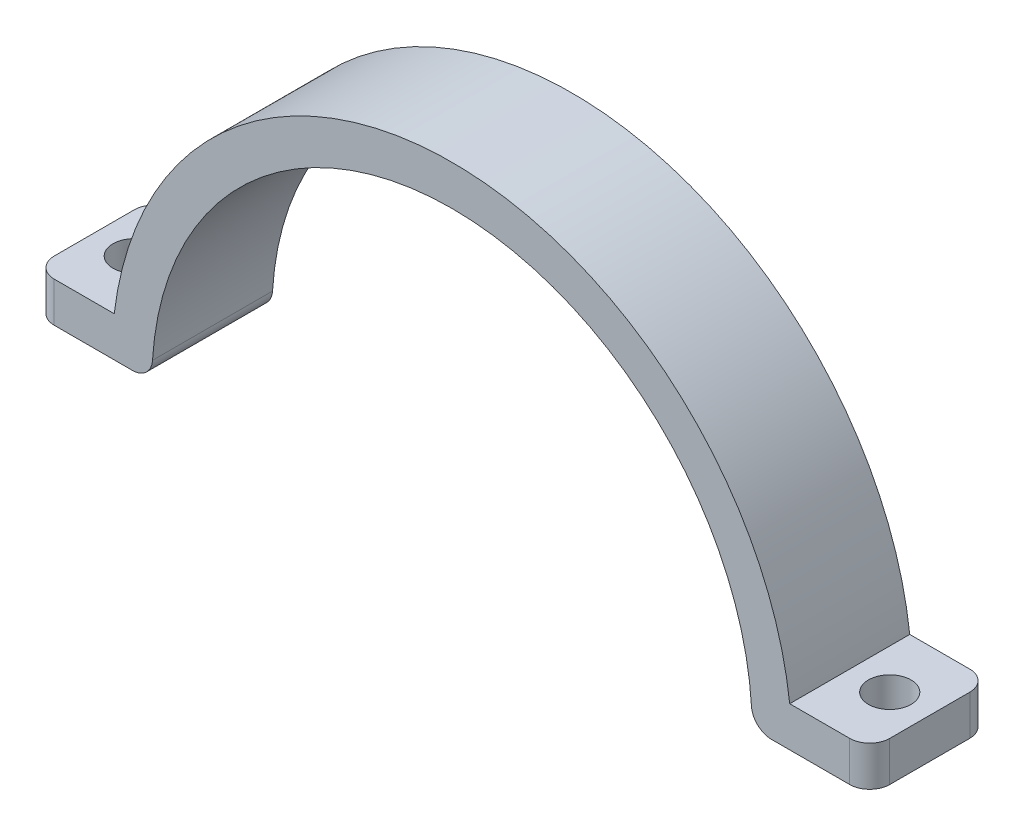
ISO-10303-21;
HEADER;
FILE_DESCRIPTION(('STEP AP214'),'2;1');
FILE_NAME('part.step','',(''),(''),'','','');
FILE_SCHEMA(('AUTOMOTIVE_DESIGN { 1 0 10303 214 1 1 1 1 }'));
ENDSEC;
DATA;
#1=APPLICATION_CONTEXT('core data for automotive mechanical design processes');
#2=APPLICATION_PROTOCOL_DEFINITION('international standard','automotive_design',2000,#1);
#3=PRODUCT_CONTEXT('',#1,'mechanical');
#4=PRODUCT('Part','Part','',(#3));
#5=PRODUCT_RELATED_PRODUCT_CATEGORY('part','',(#4));
#6=PRODUCT_DEFINITION_FORMATION('','',#4);
#7=PRODUCT_DEFINITION_CONTEXT('part definition',#1,'design');
#8=PRODUCT_DEFINITION('design','',#6,#7);
#9=PRODUCT_DEFINITION_SHAPE('','',#8);
#10=(LENGTH_UNIT() NAMED_UNIT(*) SI_UNIT(.MILLI.,.METRE.));
#11=(NAMED_UNIT(*) PLANE_ANGLE_UNIT() SI_UNIT($,.RADIAN.));
#12=(NAMED_UNIT(*) SI_UNIT($,.STERADIAN.) SOLID_ANGLE_UNIT());
#13=UNCERTAINTY_MEASURE_WITH_UNIT(LENGTH_MEASURE(1.E-05),#10,'distance_accuracy_value','');
#14=(GEOMETRIC_REPRESENTATION_CONTEXT(3) GLOBAL_UNCERTAINTY_ASSIGNED_CONTEXT((#13)) GLOBAL_UNIT_ASSIGNED_CONTEXT((#10,
#11,#12)) REPRESENTATION_CONTEXT('',''));
#15=CARTESIAN_POINT('',(0.,0.,0.));
#16=DIRECTION('',(0.,0.,1.));
#17=DIRECTION('',(1.,0.,0.));
#18=AXIS2_PLACEMENT_3D('',#15,#16,#17);
#19=CARTESIAN_POINT('',(0.,0.,9.525));
#20=DIRECTION('',(0.,0.,-1.));
#21=DIRECTION('',(-1.,0.,0.));
#22=AXIS2_PLACEMENT_3D('',#19,#20,#21);
#23=CYLINDRICAL_SURFACE('',#22,47.625);
#24=CARTESIAN_POINT('',(0.,0.,-9.525));
#25=DIRECTION('',(0.,0.,-1.));
#26=DIRECTION('',(1.,0.,0.));
#27=AXIS2_PLACEMENT_3D('',#24,#25,#26);
#28=CIRCLE('',#27,47.625);
#29=CARTESIAN_POINT('',(-47.5318914065451,2.9765625,-9.525));
#30=VERTEX_POINT('',#29);
#31=CARTESIAN_POINT('',(47.5318914065451,2.9765625,-9.525));
#32=VERTEX_POINT('',#31);
#33=EDGE_CURVE('E171',#30,#32,#28,.T.);
#34=ORIENTED_EDGE('',*,*,#33,.T.);
#35=DIRECTION('',(0.,0.,-1.));
#36=VECTOR('',#35,1.);
#37=CARTESIAN_POINT('',(47.5318914065451,2.9765625,9.525));
#38=LINE('',#37,#36);
#39=CARTESIAN_POINT('',(47.5318914065451,2.9765625,9.525));
#40=VERTEX_POINT('',#39);
#41=EDGE_CURVE('E214',#32,#40,#38,.F.);
#42=ORIENTED_EDGE('',*,*,#41,.T.);
#43=CARTESIAN_POINT('',(0.,0.,9.525));
#44=DIRECTION('',(0.,0.,-1.));
#45=DIRECTION('',(1.,0.,0.));
#46=AXIS2_PLACEMENT_3D('',#43,#44,#45);
#47=CIRCLE('',#46,47.625);
#48=CARTESIAN_POINT('',(-47.5318914065451,2.9765625,9.525));
#49=VERTEX_POINT('',#48);
#50=EDGE_CURVE('E186',#49,#40,#47,.T.);
#51=ORIENTED_EDGE('',*,*,#50,.F.);
#52=DIRECTION('',(0.,0.,-1.));
#53=VECTOR('',#52,1.);
#54=CARTESIAN_POINT('',(-47.5318914065451,2.9765625,9.525));
#55=LINE('',#54,#53);
#56=EDGE_CURVE('E211',#49,#30,#55,.T.);
#57=ORIENTED_EDGE('',*,*,#56,.T.);
#58=EDGE_LOOP('',(#34,#42,#51,#57));
#59=FACE_BOUND('',#58,.T.);
#60=ADVANCED_FACE('F33',(#59),#23,.F.);
#61=CARTESIAN_POINT('',(47.625,0.,9.525));
#62=DIRECTION('',(0.,1.,0.));
#63=DIRECTION('',(0.,0.,1.));
#64=AXIS2_PLACEMENT_3D('',#61,#62,#63);
#65=PLANE('',#64);
#66=CARTESIAN_POINT('',(59.9501690762259,0.,0.));
#67=DIRECTION('',(0.,1.,0.));
#68=DIRECTION('',(0.,0.,1.));
#69=AXIS2_PLACEMENT_3D('',#66,#67,#68);
#70=CIRCLE('',#69,3.3782);
#71=CARTESIAN_POINT('',(59.9501690762259,0.,3.3782));
#72=VERTEX_POINT('',#71);
#73=EDGE_CURVE('E175',#72,#72,#70,.F.);
#74=ORIENTED_EDGE('',*,*,#73,.F.);
#75=EDGE_LOOP('',(#74));
#76=FACE_BOUND('',#75,.T.);
#77=DIRECTION('',(1.,0.,0.));
#78=VECTOR('',#77,1.);
#79=CARTESIAN_POINT('',(47.625,0.,9.525));
#80=LINE('',#79,#78);
#81=CARTESIAN_POINT('',(50.7006841669814,0.,9.525));
#82=VERTEX_POINT('',#81);
#83=CARTESIAN_POINT('',(63.1251690762259,0.,9.525));
#84=VERTEX_POINT('',#83);
#85=EDGE_CURVE('E146',#82,#84,#80,.T.);
#86=ORIENTED_EDGE('',*,*,#85,.F.);
#87=DIRECTION('',(0.,0.,-1.));
#88=VECTOR('',#87,1.);
#89=CARTESIAN_POINT('',(50.7006841669814,0.,9.525));
#90=LINE('',#89,#88);
#91=CARTESIAN_POINT('',(50.7006841669814,0.,-9.525));
#92=VERTEX_POINT('',#91);
#93=EDGE_CURVE('E200',#82,#92,#90,.T.);
#94=ORIENTED_EDGE('',*,*,#93,.T.);
#95=DIRECTION('',(1.,0.,0.));
#96=VECTOR('',#95,1.);
#97=CARTESIAN_POINT('',(47.625,0.,-9.525));
#98=LINE('',#97,#96);
#99=CARTESIAN_POINT('',(63.1251690762259,0.,-9.525));
#100=VERTEX_POINT('',#99);
#101=EDGE_CURVE('E174',#92,#100,#98,.T.);
#102=ORIENTED_EDGE('',*,*,#101,.T.);
#103=CARTESIAN_POINT('',(63.1251690762259,0.,-6.35));
#104=DIRECTION('',(0.,1.,0.));
#105=DIRECTION('',(0.,0.,1.));
#106=AXIS2_PLACEMENT_3D('',#103,#104,#105);
#107=CIRCLE('',#106,3.175);
#108=CARTESIAN_POINT('',(66.3001690762259,0.,-6.34999999999999));
#109=VERTEX_POINT('',#108);
#110=EDGE_CURVE('E198',#100,#109,#107,.F.);
#111=ORIENTED_EDGE('',*,*,#110,.T.);
#112=DIRECTION('',(0.,0.,-1.));
#113=VECTOR('',#112,1.);
#114=CARTESIAN_POINT('',(66.3001690762259,0.,9.525));
#115=LINE('',#114,#113);
#116=CARTESIAN_POINT('',(66.3001690762259,0.,6.35));
#117=VERTEX_POINT('',#116);
#118=EDGE_CURVE('E193',#117,#109,#115,.T.);
#119=ORIENTED_EDGE('',*,*,#118,.F.);
#120=CARTESIAN_POINT('',(63.1251690762259,0.,6.35));
#121=DIRECTION('',(0.,1.,0.));
#122=DIRECTION('',(0.,0.,1.));
#123=AXIS2_PLACEMENT_3D('',#120,#121,#122);
#124=CIRCLE('',#123,3.175);
#125=EDGE_CURVE('E196',#117,#84,#124,.F.);
#126=ORIENTED_EDGE('',*,*,#125,.T.);
#127=EDGE_LOOP('',(#86,#94,#102,#111,#119,#126));
#128=FACE_BOUND('',#127,.T.);
#129=ADVANCED_FACE('F295',(#76,#128),#65,.F.);
#130=CARTESIAN_POINT('',(66.3001690762259,0.,9.525));
#131=DIRECTION('',(-1.,0.,0.));
#132=DIRECTION('',(0.,0.,1.));
#133=AXIS2_PLACEMENT_3D('',#130,#131,#132);
#134=PLANE('',#133);
#135=ORIENTED_EDGE('',*,*,#118,.T.);
#136=DIRECTION('',(0.,1.,0.));
#137=VECTOR('',#136,1.);
#138=CARTESIAN_POINT('',(66.3001690762259,0.,-6.35));
#139=LINE('',#138,#137);
#140=CARTESIAN_POINT('',(66.3001690762259,6.35,-6.34999999999999));
#141=VERTEX_POINT('',#140);
#142=EDGE_CURVE('E232',#109,#141,#139,.T.);
#143=ORIENTED_EDGE('',*,*,#142,.T.);
#144=DIRECTION('',(0.,0.,-1.));
#145=VECTOR('',#144,1.);
#146=CARTESIAN_POINT('',(66.3001690762259,6.35,9.525));
#147=LINE('',#146,#145);
#148=CARTESIAN_POINT('',(66.3001690762259,6.35,6.35));
#149=VERTEX_POINT('',#148);
#150=EDGE_CURVE('E156',#149,#141,#147,.T.);
#151=ORIENTED_EDGE('',*,*,#150,.F.);
#152=DIRECTION('',(0.,1.,0.));
#153=VECTOR('',#152,1.);
#154=CARTESIAN_POINT('',(66.3001690762259,0.,6.35));
#155=LINE('',#154,#153);
#156=EDGE_CURVE('E230',#149,#117,#155,.F.);
#157=ORIENTED_EDGE('',*,*,#156,.T.);
#158=EDGE_LOOP('',(#135,#143,#151,#157));
#159=FACE_BOUND('',#158,.T.);
#160=ADVANCED_FACE('F288',(#159),#134,.F.);
#161=CARTESIAN_POINT('',(66.3001690762259,6.35,9.525));
#162=DIRECTION('',(0.,-1.,0.));
#163=DIRECTION('',(1.,0.,0.));
#164=AXIS2_PLACEMENT_3D('',#161,#162,#163);
#165=PLANE('',#164);
#166=CARTESIAN_POINT('',(59.9501690762259,6.35,0.));
#167=DIRECTION('',(0.,1.,0.));
#168=DIRECTION('',(-1.,0.,0.));
#169=AXIS2_PLACEMENT_3D('',#166,#167,#168);
#170=CIRCLE('',#169,3.3782);
#171=CARTESIAN_POINT('',(56.5719690762259,6.35,0.));
#172=VERTEX_POINT('',#171);
#173=EDGE_CURVE('E275',#172,#172,#170,.T.);
#174=ORIENTED_EDGE('',*,*,#173,.F.);
#175=EDGE_LOOP('',(#174));
#176=FACE_BOUND('',#175,.T.);
#177=ORIENTED_EDGE('',*,*,#150,.T.);
#178=CARTESIAN_POINT('',(63.1251690762259,6.35,-6.35));
#179=DIRECTION('',(0.,-1.,0.));
#180=DIRECTION('',(1.,0.,0.));
#181=AXIS2_PLACEMENT_3D('',#178,#179,#180);
#182=CIRCLE('',#181,3.175);
#183=CARTESIAN_POINT('',(63.1251690762259,6.35,-9.525));
#184=VERTEX_POINT('',#183);
#185=EDGE_CURVE('E237',#141,#184,#182,.F.);
#186=ORIENTED_EDGE('',*,*,#185,.T.);
#187=DIRECTION('',(-1.,0.,0.));
#188=VECTOR('',#187,1.);
#189=CARTESIAN_POINT('',(66.3001690762259,6.35,-9.525));
#190=LINE('',#189,#188);
#191=CARTESIAN_POINT('',(53.6001690762259,6.35,-9.525));
#192=VERTEX_POINT('',#191);
#193=EDGE_CURVE('E153',#184,#192,#190,.T.);
#194=ORIENTED_EDGE('',*,*,#193,.T.);
#195=DIRECTION('',(0.,0.,-1.));
#196=VECTOR('',#195,1.);
#197=CARTESIAN_POINT('',(53.6001690762259,6.35,9.525));
#198=LINE('',#197,#196);
#199=CARTESIAN_POINT('',(53.6001690762259,6.35,9.525));
#200=VERTEX_POINT('',#199);
#201=EDGE_CURVE('E149',#200,#192,#198,.T.);
#202=ORIENTED_EDGE('',*,*,#201,.F.);
#203=DIRECTION('',(-1.,0.,0.));
#204=VECTOR('',#203,1.);
#205=CARTESIAN_POINT('',(66.3001690762259,6.35,9.525));
#206=LINE('',#205,#204);
#207=CARTESIAN_POINT('',(63.1251690762259,6.35,9.525));
#208=VERTEX_POINT('',#207);
#209=EDGE_CURVE('E134',#208,#200,#206,.T.);
#210=ORIENTED_EDGE('',*,*,#209,.F.);
#211=CARTESIAN_POINT('',(63.1251690762259,6.35,6.35));
#212=DIRECTION('',(0.,-1.,0.));
#213=DIRECTION('',(1.,0.,0.));
#214=AXIS2_PLACEMENT_3D('',#211,#212,#213);
#215=CIRCLE('',#214,3.175);
#216=EDGE_CURVE('E235',#208,#149,#215,.F.);
#217=ORIENTED_EDGE('',*,*,#216,.T.);
#218=EDGE_LOOP('',(#177,#186,#194,#202,#210,#217));
#219=FACE_BOUND('',#218,.T.);
#220=ADVANCED_FACE('F151',(#176,#219),#165,.F.);
#221=CARTESIAN_POINT('',(0.,0.,9.525));
#222=DIRECTION('',(0.,0.,-1.));
#223=DIRECTION('',(-1.,0.,0.));
#224=AXIS2_PLACEMENT_3D('',#221,#222,#223);
#225=CYLINDRICAL_SURFACE('',#224,53.975);
#226=CARTESIAN_POINT('',(0.,0.,-9.525));
#227=DIRECTION('',(0.,0.,1.));
#228=DIRECTION('',(1.,0.,0.));
#229=AXIS2_PLACEMENT_3D('',#226,#227,#228);
#230=CIRCLE('',#229,53.975);
#231=CARTESIAN_POINT('',(-53.6001690762259,6.35,-9.525));
#232=VERTEX_POINT('',#231);
#233=EDGE_CURVE('E179',#192,#232,#230,.T.);
#234=ORIENTED_EDGE('',*,*,#233,.T.);
#235=DIRECTION('',(0.,0.,-1.));
#236=VECTOR('',#235,1.);
#237=CARTESIAN_POINT('',(-53.6001690762259,6.35,9.525));
#238=LINE('',#237,#236);
#239=CARTESIAN_POINT('',(-53.6001690762259,6.35,9.525));
#240=VERTEX_POINT('',#239);
#241=EDGE_CURVE('E157',#240,#232,#238,.T.);
#242=ORIENTED_EDGE('',*,*,#241,.F.);
#243=CARTESIAN_POINT('',(0.,0.,9.525));
#244=DIRECTION('',(0.,0.,1.));
#245=DIRECTION('',(1.,0.,0.));
#246=AXIS2_PLACEMENT_3D('',#243,#244,#245);
#247=CIRCLE('',#246,53.975);
#248=EDGE_CURVE('E140',#200,#240,#247,.T.);
#249=ORIENTED_EDGE('',*,*,#248,.F.);
#250=ORIENTED_EDGE('',*,*,#201,.T.);
#251=EDGE_LOOP('',(#234,#242,#249,#250));
#252=FACE_BOUND('',#251,.T.);
#253=ADVANCED_FACE('F159',(#252),#225,.T.);
#254=CARTESIAN_POINT('',(-66.3001690762259,6.35,9.525));
#255=DIRECTION('',(0.,-1.,0.));
#256=DIRECTION('',(1.,0.,0.));
#257=AXIS2_PLACEMENT_3D('',#254,#255,#256);
#258=PLANE('',#257);
#259=CARTESIAN_POINT('',(-59.9501690762259,6.34999999999998,0.));
#260=DIRECTION('',(0.,1.,0.));
#261=DIRECTION('',(1.,0.,0.));
#262=AXIS2_PLACEMENT_3D('',#259,#260,#261);
#263=CIRCLE('',#262,3.3782);
#264=CARTESIAN_POINT('',(-56.5719690762259,6.34999999999998,0.));
#265=VERTEX_POINT('',#264);
#266=EDGE_CURVE('E276',#265,#265,#263,.T.);
#267=ORIENTED_EDGE('',*,*,#266,.F.);
#268=EDGE_LOOP('',(#267));
#269=FACE_BOUND('',#268,.T.);
#270=DIRECTION('',(-1.,0.,0.));
#271=VECTOR('',#270,1.);
#272=CARTESIAN_POINT('',(-66.3001690762259,6.35,-9.525));
#273=LINE('',#272,#271);
#274=CARTESIAN_POINT('',(-63.1251690762259,6.35,-9.525));
#275=VERTEX_POINT('',#274);
#276=EDGE_CURVE('E181',#232,#275,#273,.T.);
#277=ORIENTED_EDGE('',*,*,#276,.T.);
#278=CARTESIAN_POINT('',(-63.1251690762259,6.35,-6.35));
#279=DIRECTION('',(0.,-1.,0.));
#280=DIRECTION('',(1.,0.,0.));
#281=AXIS2_PLACEMENT_3D('',#278,#279,#280);
#282=CIRCLE('',#281,3.175);
#283=CARTESIAN_POINT('',(-66.3001690762259,6.35,-6.34999999999999));
#284=VERTEX_POINT('',#283);
#285=EDGE_CURVE('E11',#275,#284,#282,.F.);
#286=ORIENTED_EDGE('',*,*,#285,.T.);
#287=DIRECTION('',(0.,0.,-1.));
#288=VECTOR('',#287,1.);
#289=CARTESIAN_POINT('',(-66.3001690762259,6.35,9.525));
#290=LINE('',#289,#288);
#291=CARTESIAN_POINT('',(-66.3001690762259,6.35,6.35));
#292=VERTEX_POINT('',#291);
#293=EDGE_CURVE('E189',#292,#284,#290,.T.);
#294=ORIENTED_EDGE('',*,*,#293,.F.);
#295=CARTESIAN_POINT('',(-63.1251690762259,6.35,6.35));
#296=DIRECTION('',(0.,-1.,0.));
#297=DIRECTION('',(1.,0.,0.));
#298=AXIS2_PLACEMENT_3D('',#295,#296,#297);
#299=CIRCLE('',#298,3.175);
#300=CARTESIAN_POINT('',(-63.1251690762259,6.35,9.525));
#301=VERTEX_POINT('',#300);
#302=EDGE_CURVE('E41',#292,#301,#299,.F.);
#303=ORIENTED_EDGE('',*,*,#302,.T.);
#304=DIRECTION('',(-1.,0.,0.));
#305=VECTOR('',#304,1.);
#306=CARTESIAN_POINT('',(-66.3001690762259,6.35,9.525));
#307=LINE('',#306,#305);
#308=EDGE_CURVE('E162',#240,#301,#307,.T.);
#309=ORIENTED_EDGE('',*,*,#308,.F.);
#310=ORIENTED_EDGE('',*,*,#241,.T.);
#311=EDGE_LOOP('',(#277,#286,#294,#303,#309,#310));
#312=FACE_BOUND('',#311,.T.);
#313=ADVANCED_FACE('F243',(#269,#312),#258,.F.);
#314=CARTESIAN_POINT('',(-66.3001690762259,0.,9.525));
#315=DIRECTION('',(1.,0.,0.));
#316=DIRECTION('',(0.,0.,-1.));
#317=AXIS2_PLACEMENT_3D('',#314,#315,#316);
#318=PLANE('',#317);
#319=ORIENTED_EDGE('',*,*,#293,.T.);
#320=DIRECTION('',(0.,-1.,0.));
#321=VECTOR('',#320,1.);
#322=CARTESIAN_POINT('',(-66.3001690762259,0.,-6.35));
#323=LINE('',#322,#321);
#324=CARTESIAN_POINT('',(-66.3001690762259,0.,-6.34999999999999));
#325=VERTEX_POINT('',#324);
#326=EDGE_CURVE('E240',#284,#325,#323,.T.);
#327=ORIENTED_EDGE('',*,*,#326,.T.);
#328=DIRECTION('',(0.,0.,-1.));
#329=VECTOR('',#328,1.);
#330=CARTESIAN_POINT('',(-66.3001690762259,0.,9.525));
#331=LINE('',#330,#329);
#332=CARTESIAN_POINT('',(-66.3001690762259,0.,6.35));
#333=VERTEX_POINT('',#332);
#334=EDGE_CURVE('E170',#333,#325,#331,.T.);
#335=ORIENTED_EDGE('',*,*,#334,.F.);
#336=DIRECTION('',(0.,-1.,0.));
#337=VECTOR('',#336,1.);
#338=CARTESIAN_POINT('',(-66.3001690762259,6.35,6.35));
#339=LINE('',#338,#337);
#340=EDGE_CURVE('E53',#333,#292,#339,.F.);
#341=ORIENTED_EDGE('',*,*,#340,.T.);
#342=EDGE_LOOP('',(#319,#327,#335,#341));
#343=FACE_BOUND('',#342,.T.);
#344=ADVANCED_FACE('F250',(#343),#318,.F.);
#345=CARTESIAN_POINT('',(-47.625,0.,9.525));
#346=DIRECTION('',(0.,1.,0.));
#347=DIRECTION('',(0.,0.,1.));
#348=AXIS2_PLACEMENT_3D('',#345,#346,#347);
#349=PLANE('',#348);
#350=CARTESIAN_POINT('',(-59.9501690762259,0.,0.));
#351=DIRECTION('',(0.,1.,0.));
#352=DIRECTION('',(0.,0.,1.));
#353=AXIS2_PLACEMENT_3D('',#350,#351,#352);
#354=CIRCLE('',#353,3.3782);
#355=CARTESIAN_POINT('',(-59.9501690762259,0.,3.3782));
#356=VERTEX_POINT('',#355);
#357=EDGE_CURVE('E272',#356,#356,#354,.F.);
#358=ORIENTED_EDGE('',*,*,#357,.F.);
#359=EDGE_LOOP('',(#358));
#360=FACE_BOUND('',#359,.T.);
#361=DIRECTION('',(1.,0.,0.));
#362=VECTOR('',#361,1.);
#363=CARTESIAN_POINT('',(-47.625,0.,-9.525));
#364=LINE('',#363,#362);
#365=CARTESIAN_POINT('',(-63.1251690762259,0.,-9.525));
#366=VERTEX_POINT('',#365);
#367=CARTESIAN_POINT('',(-50.7006841669814,0.,-9.525));
#368=VERTEX_POINT('',#367);
#369=EDGE_CURVE('E183',#366,#368,#364,.T.);
#370=ORIENTED_EDGE('',*,*,#369,.T.);
#371=DIRECTION('',(0.,0.,-1.));
#372=VECTOR('',#371,1.);
#373=CARTESIAN_POINT('',(-50.7006841669814,0.,9.525));
#374=LINE('',#373,#372);
#375=CARTESIAN_POINT('',(-50.7006841669814,0.,9.525));
#376=VERTEX_POINT('',#375);
#377=EDGE_CURVE('E228',#368,#376,#374,.F.);
#378=ORIENTED_EDGE('',*,*,#377,.T.);
#379=DIRECTION('',(1.,0.,0.));
#380=VECTOR('',#379,1.);
#381=CARTESIAN_POINT('',(-47.625,0.,9.525));
#382=LINE('',#381,#380);
#383=CARTESIAN_POINT('',(-63.1251690762259,0.,9.525));
#384=VERTEX_POINT('',#383);
#385=EDGE_CURVE('E164',#384,#376,#382,.T.);
#386=ORIENTED_EDGE('',*,*,#385,.F.);
#387=CARTESIAN_POINT('',(-63.1251690762259,0.,6.35));
#388=DIRECTION('',(0.,1.,0.));
#389=DIRECTION('',(0.,0.,1.));
#390=AXIS2_PLACEMENT_3D('',#387,#388,#389);
#391=CIRCLE('',#390,3.175);
#392=EDGE_CURVE('E224',#384,#333,#391,.F.);
#393=ORIENTED_EDGE('',*,*,#392,.T.);
#394=ORIENTED_EDGE('',*,*,#334,.T.);
#395=CARTESIAN_POINT('',(-63.1251690762259,0.,-6.35));
#396=DIRECTION('',(0.,1.,0.));
#397=DIRECTION('',(0.,0.,1.));
#398=AXIS2_PLACEMENT_3D('',#395,#396,#397);
#399=CIRCLE('',#398,3.175);
#400=EDGE_CURVE('E226',#325,#366,#399,.F.);
#401=ORIENTED_EDGE('',*,*,#400,.T.);
#402=EDGE_LOOP('',(#370,#378,#386,#393,#394,#401));
#403=FACE_BOUND('',#402,.T.);
#404=ADVANCED_FACE('F249',(#360,#403),#349,.F.);
#405=CARTESIAN_POINT('',(0.,0.,9.525));
#406=DIRECTION('',(0.,0.,1.));
#407=DIRECTION('',(1.,0.,0.));
#408=AXIS2_PLACEMENT_3D('',#405,#406,#407);
#409=PLANE('',#408);
#410=ORIENTED_EDGE('',*,*,#50,.T.);
#411=CARTESIAN_POINT('',(50.7006841669814,3.175,9.525));
#412=DIRECTION('',(0.,0.,1.));
#413=DIRECTION('',(1.,0.,0.));
#414=AXIS2_PLACEMENT_3D('',#411,#412,#413);
#415=CIRCLE('',#414,3.175);
#416=EDGE_CURVE('E222',#40,#82,#415,.T.);
#417=ORIENTED_EDGE('',*,*,#416,.T.);
#418=ORIENTED_EDGE('',*,*,#85,.T.);
#419=DIRECTION('',(0.,1.,0.));
#420=VECTOR('',#419,1.);
#421=CARTESIAN_POINT('',(63.1251690762259,6.35,9.525));
#422=LINE('',#421,#420);
#423=EDGE_CURVE('E144',#84,#208,#422,.T.);
#424=ORIENTED_EDGE('',*,*,#423,.T.);
#425=ORIENTED_EDGE('',*,*,#209,.T.);
#426=ORIENTED_EDGE('',*,*,#248,.T.);
#427=ORIENTED_EDGE('',*,*,#308,.T.);
#428=DIRECTION('',(0.,-1.,0.));
#429=VECTOR('',#428,1.);
#430=CARTESIAN_POINT('',(-63.1251690762259,0.,9.525));
#431=LINE('',#430,#429);
#432=EDGE_CURVE('E217',#301,#384,#431,.T.);
#433=ORIENTED_EDGE('',*,*,#432,.T.);
#434=ORIENTED_EDGE('',*,*,#385,.T.);
#435=CARTESIAN_POINT('',(-50.7006841669814,3.175,9.525));
#436=DIRECTION('',(0.,0.,1.));
#437=DIRECTION('',(1.,0.,0.));
#438=AXIS2_PLACEMENT_3D('',#435,#436,#437);
#439=CIRCLE('',#438,3.175);
#440=EDGE_CURVE('E220',#376,#49,#439,.T.);
#441=ORIENTED_EDGE('',*,*,#440,.T.);
#442=EDGE_LOOP('',(#410,#417,#418,#424,#425,#426,#427,#433,#434,#441));
#443=FACE_BOUND('',#442,.T.);
#444=ADVANCED_FACE('F137',(#443),#409,.T.);
#445=CARTESIAN_POINT('',(0.,0.,-9.525));
#446=DIRECTION('',(0.,0.,1.));
#447=DIRECTION('',(1.,0.,0.));
#448=AXIS2_PLACEMENT_3D('',#445,#446,#447);
#449=PLANE('',#448);
#450=ORIENTED_EDGE('',*,*,#101,.F.);
#451=CARTESIAN_POINT('',(50.7006841669814,3.175,-9.525));
#452=DIRECTION('',(0.,0.,1.));
#453=DIRECTION('',(1.,0.,0.));
#454=AXIS2_PLACEMENT_3D('',#451,#452,#453);
#455=CIRCLE('',#454,3.175);
#456=EDGE_CURVE('E209',#92,#32,#455,.F.);
#457=ORIENTED_EDGE('',*,*,#456,.T.);
#458=ORIENTED_EDGE('',*,*,#33,.F.);
#459=CARTESIAN_POINT('',(-50.7006841669814,3.175,-9.525));
#460=DIRECTION('',(0.,0.,1.));
#461=DIRECTION('',(1.,0.,0.));
#462=AXIS2_PLACEMENT_3D('',#459,#460,#461);
#463=CIRCLE('',#462,3.175);
#464=EDGE_CURVE('E207',#30,#368,#463,.F.);
#465=ORIENTED_EDGE('',*,*,#464,.T.);
#466=ORIENTED_EDGE('',*,*,#369,.F.);
#467=DIRECTION('',(0.,-1.,0.));
#468=VECTOR('',#467,1.);
#469=CARTESIAN_POINT('',(-63.1251690762259,0.,-9.525));
#470=LINE('',#469,#468);
#471=EDGE_CURVE('E203',#366,#275,#470,.F.);
#472=ORIENTED_EDGE('',*,*,#471,.T.);
#473=ORIENTED_EDGE('',*,*,#276,.F.);
#474=ORIENTED_EDGE('',*,*,#233,.F.);
#475=ORIENTED_EDGE('',*,*,#193,.F.);
#476=DIRECTION('',(0.,1.,0.));
#477=VECTOR('',#476,1.);
#478=CARTESIAN_POINT('',(63.1251690762259,0.,-9.525));
#479=LINE('',#478,#477);
#480=EDGE_CURVE('E205',#184,#100,#479,.F.);
#481=ORIENTED_EDGE('',*,*,#480,.T.);
#482=EDGE_LOOP('',(#450,#457,#458,#465,#466,#472,#473,#474,#475,#481));
#483=FACE_BOUND('',#482,.T.);
#484=ADVANCED_FACE('F259',(#483),#449,.F.);
#485=CARTESIAN_POINT('',(-59.9501690762259,-0.00100000000001661,0.));
#486=DIRECTION('',(0.,1.,0.));
#487=DIRECTION('',(-1.,0.,0.));
#488=AXIS2_PLACEMENT_3D('',#485,#486,#487);
#489=CYLINDRICAL_SURFACE('',#488,3.3782);
#490=ORIENTED_EDGE('',*,*,#266,.T.);
#491=EDGE_LOOP('',(#490));
#492=FACE_BOUND('',#491,.T.);
#493=ORIENTED_EDGE('',*,*,#357,.T.);
#494=EDGE_LOOP('',(#493));
#495=FACE_BOUND('',#494,.T.);
#496=ADVANCED_FACE('F373',(#492,#495),#489,.F.);
#497=CARTESIAN_POINT('',(59.9501690762259,-0.001000000000001,0.));
#498=DIRECTION('',(0.,1.,0.));
#499=DIRECTION('',(-1.,0.,0.));
#500=AXIS2_PLACEMENT_3D('',#497,#498,#499);
#501=CYLINDRICAL_SURFACE('',#500,3.3782);
#502=ORIENTED_EDGE('',*,*,#173,.T.);
#503=EDGE_LOOP('',(#502));
#504=FACE_BOUND('',#503,.T.);
#505=ORIENTED_EDGE('',*,*,#73,.T.);
#506=EDGE_LOOP('',(#505));
#507=FACE_BOUND('',#506,.T.);
#508=ADVANCED_FACE('F284',(#504,#507),#501,.F.);
#509=CARTESIAN_POINT('',(50.7006841669814,3.175,9.525));
#510=DIRECTION('',(0.,0.,-1.));
#511=DIRECTION('',(-1.,0.,0.));
#512=AXIS2_PLACEMENT_3D('',#509,#510,#511);
#513=CYLINDRICAL_SURFACE('',#512,3.175);
#514=ORIENTED_EDGE('',*,*,#416,.F.);
#515=ORIENTED_EDGE('',*,*,#41,.F.);
#516=ORIENTED_EDGE('',*,*,#456,.F.);
#517=ORIENTED_EDGE('',*,*,#93,.F.);
#518=EDGE_LOOP('',(#514,#515,#516,#517));
#519=FACE_BOUND('',#518,.T.);
#520=ADVANCED_FACE('F306',(#519),#513,.T.);
#521=CARTESIAN_POINT('',(-50.7006841669814,3.175,9.525));
#522=DIRECTION('',(0.,0.,-1.));
#523=DIRECTION('',(-1.,0.,0.));
#524=AXIS2_PLACEMENT_3D('',#521,#522,#523);
#525=CYLINDRICAL_SURFACE('',#524,3.175);
#526=ORIENTED_EDGE('',*,*,#440,.F.);
#527=ORIENTED_EDGE('',*,*,#377,.F.);
#528=ORIENTED_EDGE('',*,*,#464,.F.);
#529=ORIENTED_EDGE('',*,*,#56,.F.);
#530=EDGE_LOOP('',(#526,#527,#528,#529));
#531=FACE_BOUND('',#530,.T.);
#532=ADVANCED_FACE('F265',(#531),#525,.T.);
#533=CARTESIAN_POINT('',(63.1251690762259,0.,-6.35));
#534=DIRECTION('',(0.,1.,0.));
#535=DIRECTION('',(0.,0.,1.));
#536=AXIS2_PLACEMENT_3D('',#533,#534,#535);
#537=CYLINDRICAL_SURFACE('',#536,3.175);
#538=ORIENTED_EDGE('',*,*,#110,.F.);
#539=ORIENTED_EDGE('',*,*,#480,.F.);
#540=ORIENTED_EDGE('',*,*,#185,.F.);
#541=ORIENTED_EDGE('',*,*,#142,.F.);
#542=EDGE_LOOP('',(#538,#539,#540,#541));
#543=FACE_BOUND('',#542,.T.);
#544=ADVANCED_FACE('F312',(#543),#537,.T.);
#545=CARTESIAN_POINT('',(-63.1251690762259,0.,-6.35));
#546=DIRECTION('',(0.,-1.,0.));
#547=DIRECTION('',(0.,0.,-1.));
#548=AXIS2_PLACEMENT_3D('',#545,#546,#547);
#549=CYLINDRICAL_SURFACE('',#548,3.175);
#550=ORIENTED_EDGE('',*,*,#285,.F.);
#551=ORIENTED_EDGE('',*,*,#471,.F.);
#552=ORIENTED_EDGE('',*,*,#400,.F.);
#553=ORIENTED_EDGE('',*,*,#326,.F.);
#554=EDGE_LOOP('',(#550,#551,#552,#553));
#555=FACE_BOUND('',#554,.T.);
#556=ADVANCED_FACE('F253',(#555),#549,.T.);
#557=CARTESIAN_POINT('',(-63.1251690762259,0.,6.35));
#558=DIRECTION('',(0.,1.,0.));
#559=DIRECTION('',(0.,0.,1.));
#560=AXIS2_PLACEMENT_3D('',#557,#558,#559);
#561=CYLINDRICAL_SURFACE('',#560,3.175);
#562=ORIENTED_EDGE('',*,*,#302,.F.);
#563=ORIENTED_EDGE('',*,*,#340,.F.);
#564=ORIENTED_EDGE('',*,*,#392,.F.);
#565=ORIENTED_EDGE('',*,*,#432,.F.);
#566=EDGE_LOOP('',(#562,#563,#564,#565));
#567=FACE_BOUND('',#566,.T.);
#568=ADVANCED_FACE('F247',(#567),#561,.T.);
#569=CARTESIAN_POINT('',(63.1251690762259,0.,6.35));
#570=DIRECTION('',(0.,-1.,0.));
#571=DIRECTION('',(0.,0.,-1.));
#572=AXIS2_PLACEMENT_3D('',#569,#570,#571);
#573=CYLINDRICAL_SURFACE('',#572,3.175);
#574=ORIENTED_EDGE('',*,*,#125,.F.);
#575=ORIENTED_EDGE('',*,*,#156,.F.);
#576=ORIENTED_EDGE('',*,*,#216,.F.);
#577=ORIENTED_EDGE('',*,*,#423,.F.);
#578=EDGE_LOOP('',(#574,#575,#576,#577));
#579=FACE_BOUND('',#578,.T.);
#580=ADVANCED_FACE('F35',(#579),#573,.T.);
#581=CLOSED_SHELL('',(#60,#129,#160,#220,#253,#313,#344,#404,#444,#484,#496,#508,#520,#532,#544,
#556,#568,#580));
#582=MANIFOLD_SOLID_BREP('B2',#581);
#583=ADVANCED_BREP_SHAPE_REPRESENTATION('',(#18,#582),#14);
#584=SHAPE_DEFINITION_REPRESENTATION(#9,#583);
ENDSEC;
END-ISO-10303-21;
